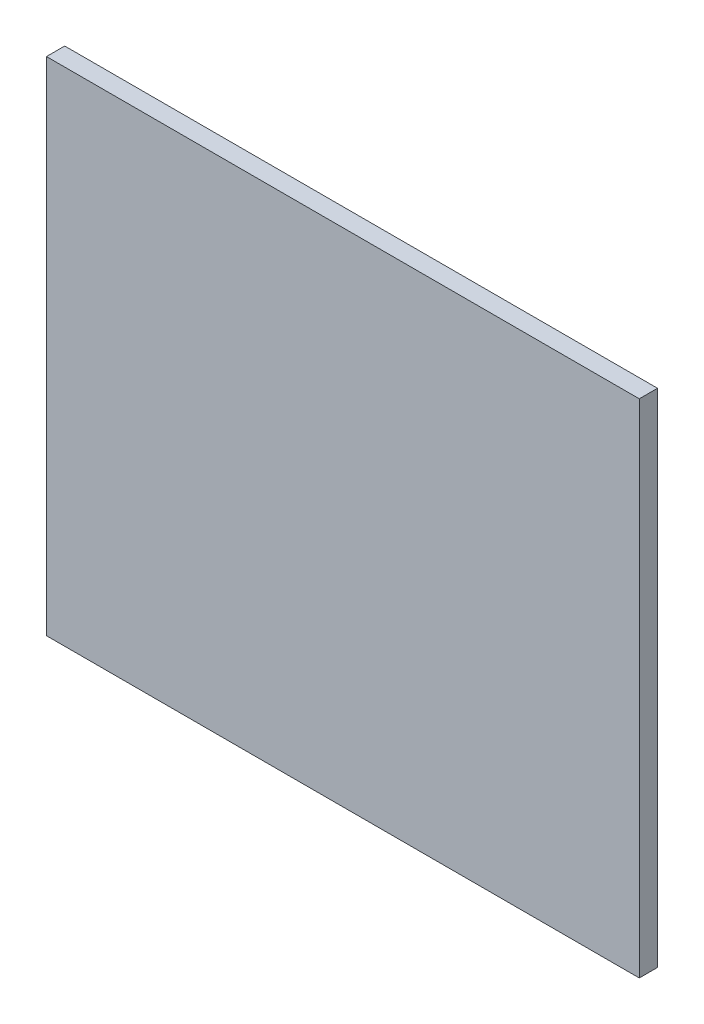
ISO-10303-21;
HEADER;
FILE_DESCRIPTION(('STEP AP214'),'2;1');
FILE_NAME('part.step','',(''),(''),'','','');
FILE_SCHEMA(('AUTOMOTIVE_DESIGN { 1 0 10303 214 1 1 1 1 }'));
ENDSEC;
DATA;
#1=APPLICATION_CONTEXT('core data for automotive mechanical design processes');
#2=APPLICATION_PROTOCOL_DEFINITION('international standard','automotive_design',2000,#1);
#3=PRODUCT_CONTEXT('',#1,'mechanical');
#4=PRODUCT('Part','Part','',(#3));
#5=PRODUCT_RELATED_PRODUCT_CATEGORY('part','',(#4));
#6=PRODUCT_DEFINITION_FORMATION('','',#4);
#7=PRODUCT_DEFINITION_CONTEXT('part definition',#1,'design');
#8=PRODUCT_DEFINITION('design','',#6,#7);
#9=PRODUCT_DEFINITION_SHAPE('','',#8);
#10=(LENGTH_UNIT() NAMED_UNIT(*) SI_UNIT(.MILLI.,.METRE.));
#11=(NAMED_UNIT(*) PLANE_ANGLE_UNIT() SI_UNIT($,.RADIAN.));
#12=(NAMED_UNIT(*) SI_UNIT($,.STERADIAN.) SOLID_ANGLE_UNIT());
#13=UNCERTAINTY_MEASURE_WITH_UNIT(LENGTH_MEASURE(1.E-05),#10,'distance_accuracy_value','');
#14=(GEOMETRIC_REPRESENTATION_CONTEXT(3) GLOBAL_UNCERTAINTY_ASSIGNED_CONTEXT((#13)) GLOBAL_UNIT_ASSIGNED_CONTEXT((#10,
#11,#12)) REPRESENTATION_CONTEXT('',''));
#15=CARTESIAN_POINT('',(0.,0.,0.));
#16=DIRECTION('',(0.,0.,1.));
#17=DIRECTION('',(1.,0.,0.));
#18=AXIS2_PLACEMENT_3D('',#15,#16,#17);
#19=CARTESIAN_POINT('',(55.,55.,40.));
#20=DIRECTION('',(1.,0.,0.));
#21=DIRECTION('',(0.,0.,-1.));
#22=AXIS2_PLACEMENT_3D('',#19,#20,#21);
#23=PLANE('',#22);
#24=DIRECTION('',(0.,-1.,0.));
#25=VECTOR('',#24,1.);
#26=CARTESIAN_POINT('',(55.,55.,36.));
#27=LINE('',#26,#25);
#28=CARTESIAN_POINT('',(55.,55.,36.));
#29=VERTEX_POINT('',#28);
#30=CARTESIAN_POINT('',(55.,-55.,36.));
#31=VERTEX_POINT('',#30);
#32=EDGE_CURVE('E105',#29,#31,#27,.T.);
#33=ORIENTED_EDGE('',*,*,#32,.T.);
#34=DIRECTION('',(0.,0.,-1.));
#35=VECTOR('',#34,1.);
#36=CARTESIAN_POINT('',(55.,-55.,40.));
#37=LINE('',#36,#35);
#38=CARTESIAN_POINT('',(55.,-55.,40.));
#39=VERTEX_POINT('',#38);
#40=EDGE_CURVE('E11',#39,#31,#37,.T.);
#41=ORIENTED_EDGE('',*,*,#40,.F.);
#42=DIRECTION('',(0.,-1.,0.));
#43=VECTOR('',#42,1.);
#44=CARTESIAN_POINT('',(55.,55.,40.));
#45=LINE('',#44,#43);
#46=CARTESIAN_POINT('',(55.,55.,40.));
#47=VERTEX_POINT('',#46);
#48=EDGE_CURVE('E89',#47,#39,#45,.T.);
#49=ORIENTED_EDGE('',*,*,#48,.F.);
#50=DIRECTION('',(0.,0.,-1.));
#51=VECTOR('',#50,1.);
#52=CARTESIAN_POINT('',(55.,55.,40.));
#53=LINE('',#52,#51);
#54=EDGE_CURVE('E97',#47,#29,#53,.T.);
#55=ORIENTED_EDGE('',*,*,#54,.T.);
#56=EDGE_LOOP('',(#33,#41,#49,#55));
#57=FACE_BOUND('',#56,.T.);
#58=ADVANCED_FACE('F39',(#57),#23,.F.);
#59=CARTESIAN_POINT('',(55.,-55.,40.));
#60=DIRECTION('',(0.,1.,0.));
#61=DIRECTION('',(0.,0.,1.));
#62=AXIS2_PLACEMENT_3D('',#59,#60,#61);
#63=PLANE('',#62);
#64=DIRECTION('',(1.,0.,0.));
#65=VECTOR('',#64,1.);
#66=CARTESIAN_POINT('',(55.,-55.,36.));
#67=LINE('',#66,#65);
#68=CARTESIAN_POINT('',(185.,-55.,36.));
#69=VERTEX_POINT('',#68);
#70=EDGE_CURVE('E92',#31,#69,#67,.T.);
#71=ORIENTED_EDGE('',*,*,#70,.T.);
#72=DIRECTION('',(0.,0.,-1.));
#73=VECTOR('',#72,1.);
#74=CARTESIAN_POINT('',(185.,-55.,40.));
#75=LINE('',#74,#73);
#76=CARTESIAN_POINT('',(185.,-55.,40.));
#77=VERTEX_POINT('',#76);
#78=EDGE_CURVE('E50',#77,#69,#75,.T.);
#79=ORIENTED_EDGE('',*,*,#78,.F.);
#80=DIRECTION('',(1.,0.,0.));
#81=VECTOR('',#80,1.);
#82=CARTESIAN_POINT('',(55.,-55.,40.));
#83=LINE('',#82,#81);
#84=EDGE_CURVE('E82',#39,#77,#83,.T.);
#85=ORIENTED_EDGE('',*,*,#84,.F.);
#86=ORIENTED_EDGE('',*,*,#40,.T.);
#87=EDGE_LOOP('',(#71,#79,#85,#86));
#88=FACE_BOUND('',#87,.T.);
#89=ADVANCED_FACE('F93',(#88),#63,.F.);
#90=CARTESIAN_POINT('',(185.,-55.,40.));
#91=DIRECTION('',(-1.,0.,0.));
#92=DIRECTION('',(0.,0.,1.));
#93=AXIS2_PLACEMENT_3D('',#90,#91,#92);
#94=PLANE('',#93);
#95=DIRECTION('',(0.,1.,0.));
#96=VECTOR('',#95,1.);
#97=CARTESIAN_POINT('',(185.,-55.,36.));
#98=LINE('',#97,#96);
#99=CARTESIAN_POINT('',(185.,55.,36.));
#100=VERTEX_POINT('',#99);
#101=EDGE_CURVE('E74',#69,#100,#98,.T.);
#102=ORIENTED_EDGE('',*,*,#101,.T.);
#103=DIRECTION('',(0.,0.,-1.));
#104=VECTOR('',#103,1.);
#105=CARTESIAN_POINT('',(185.,55.,40.));
#106=LINE('',#105,#104);
#107=CARTESIAN_POINT('',(185.,55.,40.));
#108=VERTEX_POINT('',#107);
#109=EDGE_CURVE('E94',#108,#100,#106,.T.);
#110=ORIENTED_EDGE('',*,*,#109,.F.);
#111=DIRECTION('',(0.,1.,0.));
#112=VECTOR('',#111,1.);
#113=CARTESIAN_POINT('',(185.,-55.,40.));
#114=LINE('',#113,#112);
#115=EDGE_CURVE('E88',#77,#108,#114,.T.);
#116=ORIENTED_EDGE('',*,*,#115,.F.);
#117=ORIENTED_EDGE('',*,*,#78,.T.);
#118=EDGE_LOOP('',(#102,#110,#116,#117));
#119=FACE_BOUND('',#118,.T.);
#120=ADVANCED_FACE('F96',(#119),#94,.F.);
#121=CARTESIAN_POINT('',(185.,55.,40.));
#122=DIRECTION('',(0.,-1.,0.));
#123=DIRECTION('',(0.,0.,-1.));
#124=AXIS2_PLACEMENT_3D('',#121,#122,#123);
#125=PLANE('',#124);
#126=DIRECTION('',(-1.,0.,0.));
#127=VECTOR('',#126,1.);
#128=CARTESIAN_POINT('',(185.,55.,36.));
#129=LINE('',#128,#127);
#130=EDGE_CURVE('E76',#100,#29,#129,.T.);
#131=ORIENTED_EDGE('',*,*,#130,.T.);
#132=ORIENTED_EDGE('',*,*,#54,.F.);
#133=DIRECTION('',(-1.,0.,0.));
#134=VECTOR('',#133,1.);
#135=CARTESIAN_POINT('',(185.,55.,40.));
#136=LINE('',#135,#134);
#137=EDGE_CURVE('E54',#108,#47,#136,.T.);
#138=ORIENTED_EDGE('',*,*,#137,.F.);
#139=ORIENTED_EDGE('',*,*,#109,.T.);
#140=EDGE_LOOP('',(#131,#132,#138,#139));
#141=FACE_BOUND('',#140,.T.);
#142=ADVANCED_FACE('F106',(#141),#125,.F.);
#143=CARTESIAN_POINT('',(0.,0.,40.));
#144=DIRECTION('',(0.,0.,1.));
#145=DIRECTION('',(1.,0.,0.));
#146=AXIS2_PLACEMENT_3D('',#143,#144,#145);
#147=PLANE('',#146);
#148=ORIENTED_EDGE('',*,*,#48,.T.);
#149=ORIENTED_EDGE('',*,*,#84,.T.);
#150=ORIENTED_EDGE('',*,*,#115,.T.);
#151=ORIENTED_EDGE('',*,*,#137,.T.);
#152=EDGE_LOOP('',(#148,#149,#150,#151));
#153=FACE_BOUND('',#152,.T.);
#154=ADVANCED_FACE('F86',(#153),#147,.T.);
#155=CARTESIAN_POINT('',(0.,0.,36.));
#156=DIRECTION('',(0.,0.,1.));
#157=DIRECTION('',(1.,0.,0.));
#158=AXIS2_PLACEMENT_3D('',#155,#156,#157);
#159=PLANE('',#158);
#160=ORIENTED_EDGE('',*,*,#32,.F.);
#161=ORIENTED_EDGE('',*,*,#130,.F.);
#162=ORIENTED_EDGE('',*,*,#101,.F.);
#163=ORIENTED_EDGE('',*,*,#70,.F.);
#164=EDGE_LOOP('',(#160,#161,#162,#163));
#165=FACE_BOUND('',#164,.T.);
#166=ADVANCED_FACE('F115',(#165),#159,.F.);
#167=CLOSED_SHELL('',(#58,#89,#120,#142,#154,#166));
#168=MANIFOLD_SOLID_BREP('B2',#167);
#169=ADVANCED_BREP_SHAPE_REPRESENTATION('',(#18,#168),#14);
#170=SHAPE_DEFINITION_REPRESENTATION(#9,#169);
ENDSEC;
END-ISO-10303-21;
